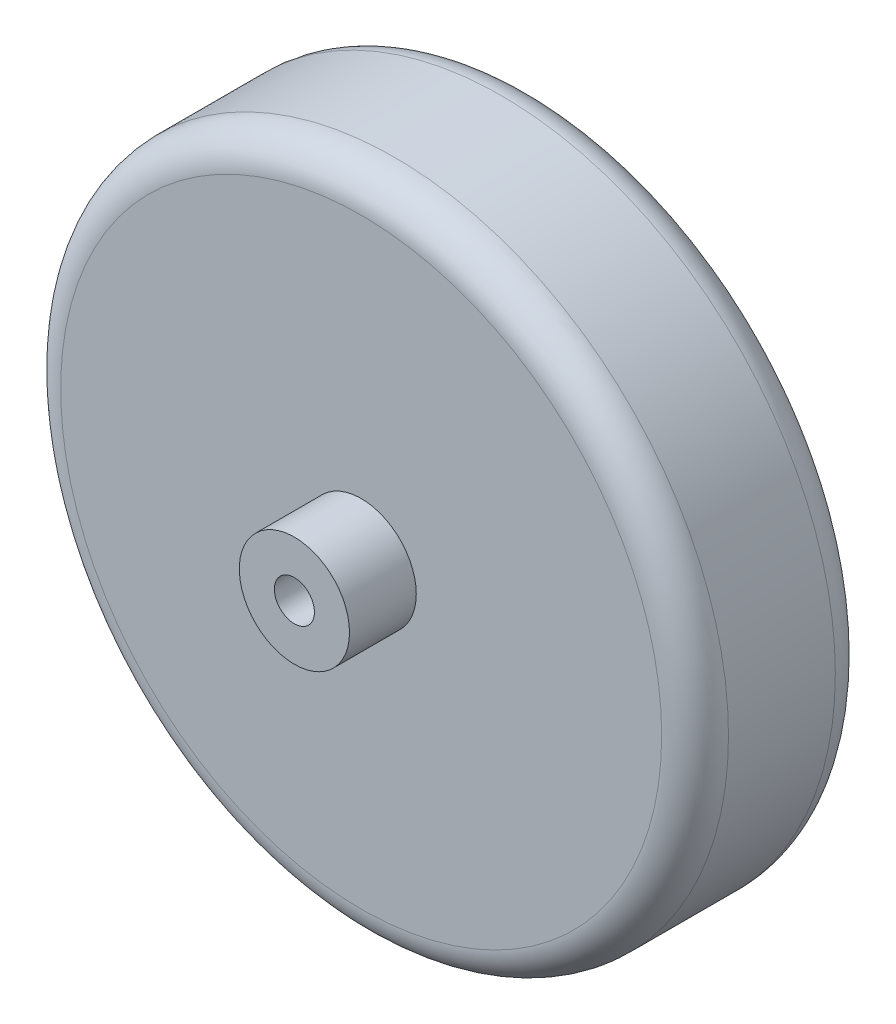
ISO-10303-21;
HEADER;
FILE_DESCRIPTION(('STEP AP214'),'2;1');
FILE_NAME('part.step','',(''),(''),'','','');
FILE_SCHEMA(('AUTOMOTIVE_DESIGN { 1 0 10303 214 1 1 1 1 }'));
ENDSEC;
DATA;
#1=APPLICATION_CONTEXT('core data for automotive mechanical design processes');
#2=APPLICATION_PROTOCOL_DEFINITION('international standard','automotive_design',2000,#1);
#3=PRODUCT_CONTEXT('',#1,'mechanical');
#4=PRODUCT('Part','Part','',(#3));
#5=PRODUCT_RELATED_PRODUCT_CATEGORY('part','',(#4));
#6=PRODUCT_DEFINITION_FORMATION('','',#4);
#7=PRODUCT_DEFINITION_CONTEXT('part definition',#1,'design');
#8=PRODUCT_DEFINITION('design','',#6,#7);
#9=PRODUCT_DEFINITION_SHAPE('','',#8);
#10=(LENGTH_UNIT() NAMED_UNIT(*) SI_UNIT(.MILLI.,.METRE.));
#11=(NAMED_UNIT(*) PLANE_ANGLE_UNIT() SI_UNIT($,.RADIAN.));
#12=(NAMED_UNIT(*) SI_UNIT($,.STERADIAN.) SOLID_ANGLE_UNIT());
#13=UNCERTAINTY_MEASURE_WITH_UNIT(LENGTH_MEASURE(1.E-05),#10,'distance_accuracy_value','');
#14=(GEOMETRIC_REPRESENTATION_CONTEXT(3) GLOBAL_UNCERTAINTY_ASSIGNED_CONTEXT((#13)) GLOBAL_UNIT_ASSIGNED_CONTEXT((#10,
#11,#12)) REPRESENTATION_CONTEXT('',''));
#15=CARTESIAN_POINT('',(0.,0.,0.));
#16=DIRECTION('',(0.,0.,1.));
#17=DIRECTION('',(1.,0.,0.));
#18=AXIS2_PLACEMENT_3D('',#15,#16,#17);
#19=CARTESIAN_POINT('',(0.,0.,26.));
#20=DIRECTION('',(0.,0.,1.));
#21=DIRECTION('',(1.,0.,0.));
#22=AXIS2_PLACEMENT_3D('',#19,#20,#21);
#23=PLANE('',#22);
#24=CARTESIAN_POINT('',(0.,0.,26.));
#25=DIRECTION('',(0.,0.,1.));
#26=DIRECTION('',(1.,0.,0.));
#27=AXIS2_PLACEMENT_3D('',#24,#25,#26);
#28=CIRCLE('',#27,8.24861184870503);
#29=CARTESIAN_POINT('',(8.24861184870503,0.,26.));
#30=VERTEX_POINT('',#29);
#31=EDGE_CURVE('E55',#30,#30,#28,.T.);
#32=ORIENTED_EDGE('',*,*,#31,.F.);
#33=EDGE_LOOP('',(#32));
#34=FACE_BOUND('',#33,.T.);
#35=CARTESIAN_POINT('',(0.,0.,26.));
#36=DIRECTION('',(0.,0.,1.));
#37=DIRECTION('',(1.,0.,0.));
#38=AXIS2_PLACEMENT_3D('',#35,#36,#37);
#39=CIRCLE('',#38,45.);
#40=CARTESIAN_POINT('',(45.,0.,26.));
#41=VERTEX_POINT('',#40);
#42=EDGE_CURVE('E10',#41,#41,#39,.T.);
#43=ORIENTED_EDGE('',*,*,#42,.T.);
#44=EDGE_LOOP('',(#43));
#45=FACE_BOUND('',#44,.T.);
#46=ADVANCED_FACE('F31',(#34,#45),#23,.T.);
#47=CARTESIAN_POINT('',(0.,0.,0.));
#48=DIRECTION('',(0.,0.,1.));
#49=DIRECTION('',(1.,0.,0.));
#50=AXIS2_PLACEMENT_3D('',#47,#48,#49);
#51=PLANE('',#50);
#52=CARTESIAN_POINT('',(0.,0.,0.));
#53=DIRECTION('',(0.,0.,1.));
#54=DIRECTION('',(1.,0.,0.));
#55=AXIS2_PLACEMENT_3D('',#52,#53,#54);
#56=CIRCLE('',#55,45.);
#57=CARTESIAN_POINT('',(45.,0.,0.));
#58=VERTEX_POINT('',#57);
#59=EDGE_CURVE('E38',#58,#58,#56,.F.);
#60=ORIENTED_EDGE('',*,*,#59,.T.);
#61=EDGE_LOOP('',(#60));
#62=FACE_BOUND('',#61,.T.);
#63=CARTESIAN_POINT('',(0.,0.,0.));
#64=DIRECTION('',(0.,0.,1.));
#65=DIRECTION('',(1.,0.,0.));
#66=AXIS2_PLACEMENT_3D('',#63,#64,#65);
#67=CIRCLE('',#66,3.);
#68=CARTESIAN_POINT('',(-3.,0.,0.));
#69=VERTEX_POINT('',#68);
#70=EDGE_CURVE('E51',#69,#69,#67,.T.);
#71=ORIENTED_EDGE('',*,*,#70,.T.);
#72=EDGE_LOOP('',(#71));
#73=FACE_BOUND('',#72,.T.);
#74=ADVANCED_FACE('F80',(#62,#73),#51,.F.);
#75=CARTESIAN_POINT('',(0.,0.,26.));
#76=DIRECTION('',(0.,0.,-1.));
#77=DIRECTION('',(-1.,0.,0.));
#78=AXIS2_PLACEMENT_3D('',#75,#76,#77);
#79=CYLINDRICAL_SURFACE('',#78,50.);
#80=CARTESIAN_POINT('',(0.,0.,5.));
#81=DIRECTION('',(0.,0.,1.));
#82=DIRECTION('',(1.,0.,0.));
#83=AXIS2_PLACEMENT_3D('',#80,#81,#82);
#84=CIRCLE('',#83,50.);
#85=CARTESIAN_POINT('',(-50.,0.,5.));
#86=VERTEX_POINT('',#85);
#87=EDGE_CURVE('E42',#86,#86,#84,.T.);
#88=CARTESIAN_POINT('',(0.,0.,21.));
#89=DIRECTION('',(0.,0.,1.));
#90=DIRECTION('',(1.,0.,0.));
#91=AXIS2_PLACEMENT_3D('',#88,#89,#90);
#92=CIRCLE('',#91,50.);
#93=CARTESIAN_POINT('',(-50.,0.,21.));
#94=VERTEX_POINT('',#93);
#95=EDGE_CURVE('E46',#94,#94,#92,.F.);
#96=CARTESIAN_POINT('',(-50.,0.,5.));
#97=CARTESIAN_POINT('',(-50.,0.,5.16666666666666));
#98=CARTESIAN_POINT('',(-50.,0.,5.33333333333333));
#99=CARTESIAN_POINT('',(-50.,0.,5.66666666666666));
#100=CARTESIAN_POINT('',(-50.,0.,5.83333333333333));
#101=CARTESIAN_POINT('',(-50.,0.,6.16666666666667));
#102=CARTESIAN_POINT('',(-50.,0.,6.33333333333333));
#103=CARTESIAN_POINT('',(-50.,0.,6.66666666666667));
#104=CARTESIAN_POINT('',(-50.,0.,6.83333333333333));
#105=CARTESIAN_POINT('',(-50.,0.,7.16666666666667));
#106=CARTESIAN_POINT('',(-50.,0.,7.33333333333333));
#107=CARTESIAN_POINT('',(-50.,0.,7.66666666666666));
#108=CARTESIAN_POINT('',(-50.,0.,7.83333333333333));
#109=CARTESIAN_POINT('',(-50.,0.,8.16666666666666));
#110=CARTESIAN_POINT('',(-50.,0.,8.33333333333333));
#111=CARTESIAN_POINT('',(-50.,0.,8.66666666666666));
#112=CARTESIAN_POINT('',(-50.,0.,8.83333333333333));
#113=CARTESIAN_POINT('',(-50.,0.,9.16666666666666));
#114=CARTESIAN_POINT('',(-50.,0.,9.33333333333333));
#115=CARTESIAN_POINT('',(-50.,0.,9.66666666666667));
#116=CARTESIAN_POINT('',(-50.,0.,9.83333333333333));
#117=CARTESIAN_POINT('',(-50.,0.,10.1666666666667));
#118=CARTESIAN_POINT('',(-50.,0.,10.3333333333333));
#119=CARTESIAN_POINT('',(-50.,0.,10.6666666666667));
#120=CARTESIAN_POINT('',(-50.,0.,10.8333333333333));
#121=CARTESIAN_POINT('',(-50.,0.,11.1666666666667));
#122=CARTESIAN_POINT('',(-50.,0.,11.3333333333333));
#123=CARTESIAN_POINT('',(-50.,0.,11.6666666666667));
#124=CARTESIAN_POINT('',(-50.,0.,11.8333333333333));
#125=CARTESIAN_POINT('',(-50.,0.,12.1666666666667));
#126=CARTESIAN_POINT('',(-50.,0.,12.3333333333333));
#127=CARTESIAN_POINT('',(-50.,0.,12.6666666666667));
#128=CARTESIAN_POINT('',(-50.,0.,12.8333333333333));
#129=CARTESIAN_POINT('',(-50.,0.,13.1666666666667));
#130=CARTESIAN_POINT('',(-50.,0.,13.3333333333333));
#131=CARTESIAN_POINT('',(-50.,0.,13.6666666666667));
#132=CARTESIAN_POINT('',(-50.,0.,13.8333333333333));
#133=CARTESIAN_POINT('',(-50.,0.,14.1666666666667));
#134=CARTESIAN_POINT('',(-50.,0.,14.3333333333333));
#135=CARTESIAN_POINT('',(-50.,0.,14.6666666666667));
#136=CARTESIAN_POINT('',(-50.,0.,14.8333333333333));
#137=CARTESIAN_POINT('',(-50.,0.,15.1666666666667));
#138=CARTESIAN_POINT('',(-50.,0.,15.3333333333333));
#139=CARTESIAN_POINT('',(-50.,0.,15.6666666666667));
#140=CARTESIAN_POINT('',(-50.,0.,15.8333333333333));
#141=CARTESIAN_POINT('',(-50.,0.,16.1666666666667));
#142=CARTESIAN_POINT('',(-50.,0.,16.3333333333333));
#143=CARTESIAN_POINT('',(-50.,0.,16.6666666666667));
#144=CARTESIAN_POINT('',(-50.,0.,16.8333333333333));
#145=CARTESIAN_POINT('',(-50.,0.,17.1666666666667));
#146=CARTESIAN_POINT('',(-50.,0.,17.3333333333333));
#147=CARTESIAN_POINT('',(-50.,0.,17.6666666666667));
#148=CARTESIAN_POINT('',(-50.,0.,17.8333333333333));
#149=CARTESIAN_POINT('',(-50.,0.,18.1666666666667));
#150=CARTESIAN_POINT('',(-50.,0.,18.3333333333333));
#151=CARTESIAN_POINT('',(-50.,0.,18.6666666666667));
#152=CARTESIAN_POINT('',(-50.,0.,18.8333333333333));
#153=CARTESIAN_POINT('',(-50.,0.,19.1666666666667));
#154=CARTESIAN_POINT('',(-50.,0.,19.3333333333333));
#155=CARTESIAN_POINT('',(-50.,0.,19.6666666666667));
#156=CARTESIAN_POINT('',(-50.,0.,19.8333333333333));
#157=CARTESIAN_POINT('',(-50.,0.,20.1666666666667));
#158=CARTESIAN_POINT('',(-50.,0.,20.3333333333333));
#159=CARTESIAN_POINT('',(-50.,0.,20.6666666666667));
#160=CARTESIAN_POINT('',(-50.,0.,20.8333333333333));
#161=CARTESIAN_POINT('',(-50.,0.,21.));
#162=B_SPLINE_CURVE_WITH_KNOTS('',3,(#96,#97,#98,#99,#100,#101,#102,#103,#104,#105,#106,#107,
#108,#109,#110,#111,#112,#113,#114,#115,#116,#117,#118,#119,#120,#121,#122,#123,#124,#125,#126,
#127,#128,#129,#130,#131,#132,#133,#134,#135,#136,#137,#138,#139,#140,#141,#142,#143,#144,#145,
#146,#147,#148,#149,#150,#151,#152,#153,#154,#155,#156,#157,#158,#159,#160,#161),.UNSPECIFIED.,
.F.,.F.,(4,2,2,2,2,2,2,2,2,2,2,2,2,2,2,2,2,2,2,2,2,2,2,2,2,2,2,2,2,2,2,2,4),(0.,0.5,1.,1.5,2.,
2.5,3.,3.5,4.,4.5,5.,5.5,6.,6.5,7.,7.5,8.,8.5,9.,9.5,10.,10.5,11.,11.5,12.,12.5,13.,13.5,14.,
14.5,15.,15.5,16.),.UNSPECIFIED.);
#163=EDGE_CURVE('BSEAM85',#86,#94,#162,.T.);
#164=ORIENTED_EDGE('',*,*,#87,.T.);
#165=ORIENTED_EDGE('',*,*,#95,.T.);
#166=ORIENTED_EDGE('',*,*,#163,.T.);
#167=ORIENTED_EDGE('',*,*,#163,.F.);
#168=EDGE_LOOP('',(#164,#166,#165,#167));
#169=FACE_BOUND('',#168,.T.);
#170=ADVANCED_FACE('F85',(#169),#79,.T.);
#171=CARTESIAN_POINT('',(0.,0.,26.));
#172=DIRECTION('',(0.,0.,-1.));
#173=DIRECTION('',(-1.,0.,0.));
#174=AXIS2_PLACEMENT_3D('',#171,#172,#173);
#175=CYLINDRICAL_SURFACE('',#174,3.);
#176=CARTESIAN_POINT('',(0.,0.,36.));
#177=DIRECTION('',(0.,0.,1.));
#178=DIRECTION('',(1.,0.,0.));
#179=AXIS2_PLACEMENT_3D('',#176,#177,#178);
#180=CIRCLE('',#179,3.);
#181=CARTESIAN_POINT('',(-3.,0.,36.));
#182=VERTEX_POINT('',#181);
#183=EDGE_CURVE('E58',#182,#182,#180,.T.);
#184=CARTESIAN_POINT('',(-3.,0.,36.));
#185=CARTESIAN_POINT('',(-3.,0.,35.625));
#186=CARTESIAN_POINT('',(-3.,0.,35.25));
#187=CARTESIAN_POINT('',(-3.,0.,34.5));
#188=CARTESIAN_POINT('',(-3.,0.,34.125));
#189=CARTESIAN_POINT('',(-3.,0.,33.375));
#190=CARTESIAN_POINT('',(-3.,0.,33.));
#191=CARTESIAN_POINT('',(-3.,0.,32.25));
#192=CARTESIAN_POINT('',(-3.,0.,31.875));
#193=CARTESIAN_POINT('',(-3.,0.,31.125));
#194=CARTESIAN_POINT('',(-3.,0.,30.75));
#195=CARTESIAN_POINT('',(-3.,0.,30.));
#196=CARTESIAN_POINT('',(-3.,0.,29.625));
#197=CARTESIAN_POINT('',(-3.,0.,28.875));
#198=CARTESIAN_POINT('',(-3.,0.,28.5));
#199=CARTESIAN_POINT('',(-3.,0.,27.75));
#200=CARTESIAN_POINT('',(-3.,0.,27.375));
#201=CARTESIAN_POINT('',(-3.,0.,26.625));
#202=CARTESIAN_POINT('',(-3.,0.,26.25));
#203=CARTESIAN_POINT('',(-3.,0.,25.5));
#204=CARTESIAN_POINT('',(-3.,0.,25.125));
#205=CARTESIAN_POINT('',(-3.,0.,24.375));
#206=CARTESIAN_POINT('',(-3.,0.,24.));
#207=CARTESIAN_POINT('',(-3.,0.,23.25));
#208=CARTESIAN_POINT('',(-3.,0.,22.875));
#209=CARTESIAN_POINT('',(-3.,0.,22.125));
#210=CARTESIAN_POINT('',(-3.,0.,21.75));
#211=CARTESIAN_POINT('',(-3.,0.,21.));
#212=CARTESIAN_POINT('',(-3.,0.,20.625));
#213=CARTESIAN_POINT('',(-3.,0.,19.875));
#214=CARTESIAN_POINT('',(-3.,0.,19.5));
#215=CARTESIAN_POINT('',(-3.,0.,18.75));
#216=CARTESIAN_POINT('',(-3.,0.,18.375));
#217=CARTESIAN_POINT('',(-3.,0.,17.625));
#218=CARTESIAN_POINT('',(-3.,0.,17.25));
#219=CARTESIAN_POINT('',(-3.,0.,16.5));
#220=CARTESIAN_POINT('',(-3.,0.,16.125));
#221=CARTESIAN_POINT('',(-3.,0.,15.375));
#222=CARTESIAN_POINT('',(-3.,0.,15.));
#223=CARTESIAN_POINT('',(-3.,0.,14.25));
#224=CARTESIAN_POINT('',(-3.,0.,13.875));
#225=CARTESIAN_POINT('',(-3.,0.,13.125));
#226=CARTESIAN_POINT('',(-3.,0.,12.75));
#227=CARTESIAN_POINT('',(-3.,0.,12.));
#228=CARTESIAN_POINT('',(-3.,0.,11.625));
#229=CARTESIAN_POINT('',(-3.,0.,10.875));
#230=CARTESIAN_POINT('',(-3.,0.,10.5));
#231=CARTESIAN_POINT('',(-3.,0.,9.75));
#232=CARTESIAN_POINT('',(-3.,0.,9.375));
#233=CARTESIAN_POINT('',(-3.,0.,8.625));
#234=CARTESIAN_POINT('',(-3.,0.,8.25));
#235=CARTESIAN_POINT('',(-3.,0.,7.5));
#236=CARTESIAN_POINT('',(-3.,0.,7.125));
#237=CARTESIAN_POINT('',(-3.,0.,6.375));
#238=CARTESIAN_POINT('',(-3.,0.,6.));
#239=CARTESIAN_POINT('',(-3.,0.,5.25));
#240=CARTESIAN_POINT('',(-3.,0.,4.875));
#241=CARTESIAN_POINT('',(-3.,0.,4.125));
#242=CARTESIAN_POINT('',(-3.,0.,3.75));
#243=CARTESIAN_POINT('',(-3.,0.,3.));
#244=CARTESIAN_POINT('',(-3.,0.,2.625));
#245=CARTESIAN_POINT('',(-3.,0.,1.875));
#246=CARTESIAN_POINT('',(-3.,0.,1.5));
#247=CARTESIAN_POINT('',(-3.,0.,0.749999999999997));
#248=CARTESIAN_POINT('',(-3.,0.,0.374999999999997));
#249=CARTESIAN_POINT('',(-3.,0.,0.));
#250=B_SPLINE_CURVE_WITH_KNOTS('',3,(#184,#185,#186,#187,#188,#189,#190,#191,#192,#193,#194,
#195,#196,#197,#198,#199,#200,#201,#202,#203,#204,#205,#206,#207,#208,#209,#210,#211,#212,#213,
#214,#215,#216,#217,#218,#219,#220,#221,#222,#223,#224,#225,#226,#227,#228,#229,#230,#231,#232,
#233,#234,#235,#236,#237,#238,#239,#240,#241,#242,#243,#244,#245,#246,#247,#248,#249),
.UNSPECIFIED.,.F.,.F.,(4,2,2,2,2,2,2,2,2,2,2,2,2,2,2,2,2,2,2,2,2,2,2,2,2,2,2,2,2,2,2,2,4),(0.,
1.125,2.25,3.375,4.5,5.625,6.75,7.875,9.,10.125,11.25,12.375,13.5,14.625,15.75,16.875,18.,
19.125,20.25,21.375,22.5,23.625,24.75,25.875,27.,28.125,29.25,30.375,31.5,32.625,33.75,34.875,
36.),.UNSPECIFIED.);
#251=EDGE_CURVE('BSEAM64',#182,#69,#250,.T.);
#252=ORIENTED_EDGE('',*,*,#183,.T.);
#253=ORIENTED_EDGE('',*,*,#70,.F.);
#254=ORIENTED_EDGE('',*,*,#251,.T.);
#255=ORIENTED_EDGE('',*,*,#251,.F.);
#256=EDGE_LOOP('',(#252,#254,#253,#255));
#257=FACE_BOUND('',#256,.T.);
#258=ADVANCED_FACE('F64',(#257),#175,.F.);
#259=CARTESIAN_POINT('',(0.,0.,5.));
#260=DIRECTION('',(0.,0.,1.));
#261=DIRECTION('',(1.,0.,0.));
#262=AXIS2_PLACEMENT_3D('',#259,#260,#261);
#263=TOROIDAL_SURFACE('',#262,45.,5.);
#264=ORIENTED_EDGE('',*,*,#59,.F.);
#265=EDGE_LOOP('',(#264));
#266=FACE_BOUND('',#265,.T.);
#267=ORIENTED_EDGE('',*,*,#87,.F.);
#268=EDGE_LOOP('',(#267));
#269=FACE_BOUND('',#268,.T.);
#270=ADVANCED_FACE('F91',(#266,#269),#263,.T.);
#271=CARTESIAN_POINT('',(0.,0.,21.));
#272=DIRECTION('',(0.,0.,1.));
#273=DIRECTION('',(1.,0.,0.));
#274=AXIS2_PLACEMENT_3D('',#271,#272,#273);
#275=TOROIDAL_SURFACE('',#274,45.,5.);
#276=ORIENTED_EDGE('',*,*,#95,.F.);
#277=EDGE_LOOP('',(#276));
#278=FACE_BOUND('',#277,.T.);
#279=ORIENTED_EDGE('',*,*,#42,.F.);
#280=EDGE_LOOP('',(#279));
#281=FACE_BOUND('',#280,.T.);
#282=ADVANCED_FACE('F33',(#278,#281),#275,.T.);
#283=CARTESIAN_POINT('',(0.,0.,36.));
#284=DIRECTION('',(0.,0.,-1.));
#285=DIRECTION('',(-1.,0.,0.));
#286=AXIS2_PLACEMENT_3D('',#283,#284,#285);
#287=CYLINDRICAL_SURFACE('',#286,8.24861184870503);
#288=CARTESIAN_POINT('',(0.,0.,36.));
#289=DIRECTION('',(0.,0.,1.));
#290=DIRECTION('',(1.,0.,0.));
#291=AXIS2_PLACEMENT_3D('',#288,#289,#290);
#292=CIRCLE('',#291,8.24861184870503);
#293=CARTESIAN_POINT('',(8.24861184870503,0.,36.));
#294=VERTEX_POINT('',#293);
#295=EDGE_CURVE('E54',#294,#294,#292,.T.);
#296=ORIENTED_EDGE('',*,*,#295,.F.);
#297=EDGE_LOOP('',(#296));
#298=FACE_BOUND('',#297,.T.);
#299=ORIENTED_EDGE('',*,*,#31,.T.);
#300=EDGE_LOOP('',(#299));
#301=FACE_BOUND('',#300,.T.);
#302=ADVANCED_FACE('F70',(#298,#301),#287,.T.);
#303=CARTESIAN_POINT('',(0.,0.,36.));
#304=DIRECTION('',(0.,0.,1.));
#305=DIRECTION('',(1.,0.,0.));
#306=AXIS2_PLACEMENT_3D('',#303,#304,#305);
#307=PLANE('',#306);
#308=ORIENTED_EDGE('',*,*,#183,.F.);
#309=EDGE_LOOP('',(#308));
#310=FACE_BOUND('',#309,.T.);
#311=ORIENTED_EDGE('',*,*,#295,.T.);
#312=EDGE_LOOP('',(#311));
#313=FACE_BOUND('',#312,.T.);
#314=ADVANCED_FACE('F67',(#310,#313),#307,.T.);
#315=CLOSED_SHELL('',(#46,#74,#170,#258,#270,#282,#302,#314));
#316=MANIFOLD_SOLID_BREP('B2',#315);
#317=ADVANCED_BREP_SHAPE_REPRESENTATION('',(#18,#316),#14);
#318=SHAPE_DEFINITION_REPRESENTATION(#9,#317);
ENDSEC;
END-ISO-10303-21;
